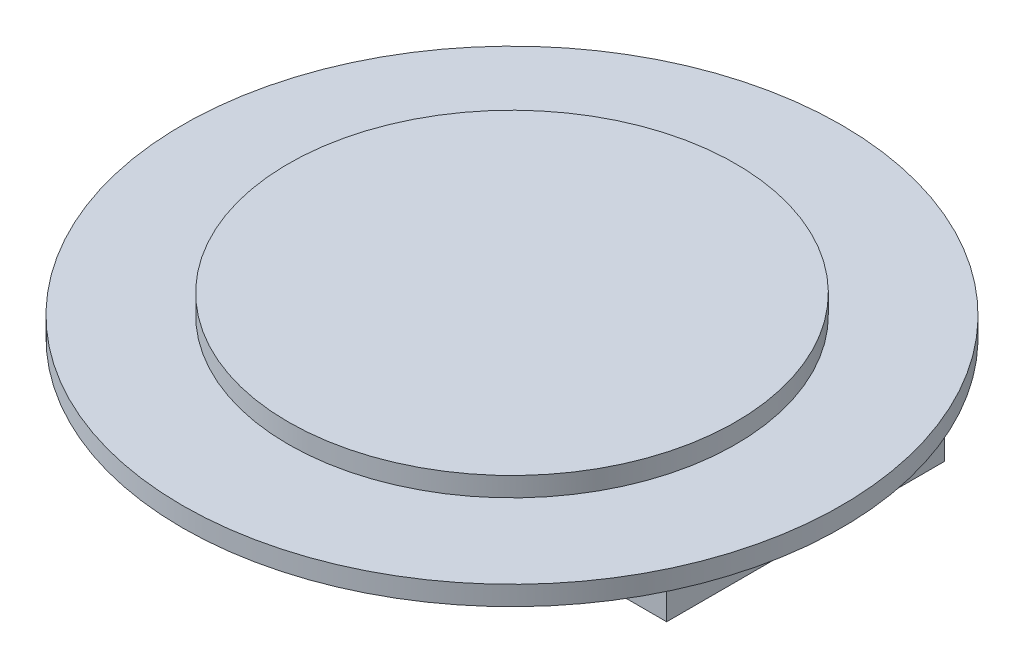
ISO-10303-21;
HEADER;
FILE_DESCRIPTION(('STEP AP214'),'2;1');
FILE_NAME('part.step','',(''),(''),'','','');
FILE_SCHEMA(('AUTOMOTIVE_DESIGN { 1 0 10303 214 1 1 1 1 }'));
ENDSEC;
DATA;
#1=APPLICATION_CONTEXT('core data for automotive mechanical design processes');
#2=APPLICATION_PROTOCOL_DEFINITION('international standard','automotive_design',2000,#1);
#3=PRODUCT_CONTEXT('',#1,'mechanical');
#4=PRODUCT('Part','Part','',(#3));
#5=PRODUCT_RELATED_PRODUCT_CATEGORY('part','',(#4));
#6=PRODUCT_DEFINITION_FORMATION('','',#4);
#7=PRODUCT_DEFINITION_CONTEXT('part definition',#1,'design');
#8=PRODUCT_DEFINITION('design','',#6,#7);
#9=PRODUCT_DEFINITION_SHAPE('','',#8);
#10=(LENGTH_UNIT() NAMED_UNIT(*) SI_UNIT(.MILLI.,.METRE.));
#11=(NAMED_UNIT(*) PLANE_ANGLE_UNIT() SI_UNIT($,.RADIAN.));
#12=(NAMED_UNIT(*) SI_UNIT($,.STERADIAN.) SOLID_ANGLE_UNIT());
#13=UNCERTAINTY_MEASURE_WITH_UNIT(LENGTH_MEASURE(1.E-05),#10,'distance_accuracy_value','');
#14=(GEOMETRIC_REPRESENTATION_CONTEXT(3) GLOBAL_UNCERTAINTY_ASSIGNED_CONTEXT((#13)) GLOBAL_UNIT_ASSIGNED_CONTEXT((#10,
#11,#12)) REPRESENTATION_CONTEXT('',''));
#15=CARTESIAN_POINT('',(0.,0.,0.));
#16=DIRECTION('',(0.,0.,1.));
#17=DIRECTION('',(1.,0.,0.));
#18=AXIS2_PLACEMENT_3D('',#15,#16,#17);
#19=CARTESIAN_POINT('',(0.,1.,0.));
#20=DIRECTION('',(0.,1.,0.));
#21=DIRECTION('',(0.,0.,1.));
#22=AXIS2_PLACEMENT_3D('',#19,#20,#21);
#23=PLANE('',#22);
#24=CARTESIAN_POINT('',(0.,1.,0.));
#25=DIRECTION('',(0.,1.,0.));
#26=DIRECTION('',(0.,0.,1.));
#27=AXIS2_PLACEMENT_3D('',#24,#25,#26);
#28=CIRCLE('',#27,17.);
#29=CARTESIAN_POINT('',(0.,1.,17.));
#30=VERTEX_POINT('',#29);
#31=EDGE_CURVE('E11',#30,#30,#28,.T.);
#32=ORIENTED_EDGE('',*,*,#31,.T.);
#33=EDGE_LOOP('',(#32));
#34=FACE_BOUND('',#33,.T.);
#35=CARTESIAN_POINT('',(0.,1.,0.));
#36=DIRECTION('',(0.,1.,0.));
#37=DIRECTION('',(0.,0.,1.));
#38=AXIS2_PLACEMENT_3D('',#35,#36,#37);
#39=CIRCLE('',#38,11.5392948538463);
#40=CARTESIAN_POINT('',(0.,1.,11.5392948538463));
#41=VERTEX_POINT('',#40);
#42=EDGE_CURVE('E112',#41,#41,#39,.T.);
#43=ORIENTED_EDGE('',*,*,#42,.F.);
#44=EDGE_LOOP('',(#43));
#45=FACE_BOUND('',#44,.T.);
#46=ADVANCED_FACE('F33',(#34,#45),#23,.T.);
#47=CARTESIAN_POINT('',(0.,0.,0.));
#48=DIRECTION('',(0.,1.,0.));
#49=DIRECTION('',(0.,0.,1.));
#50=AXIS2_PLACEMENT_3D('',#47,#48,#49);
#51=PLANE('',#50);
#52=CARTESIAN_POINT('',(0.,0.,0.));
#53=DIRECTION('',(0.,1.,0.));
#54=DIRECTION('',(0.,0.,1.));
#55=AXIS2_PLACEMENT_3D('',#52,#53,#54);
#56=CIRCLE('',#55,17.);
#57=CARTESIAN_POINT('',(0.,0.,17.));
#58=VERTEX_POINT('',#57);
#59=EDGE_CURVE('E37',#58,#58,#56,.T.);
#60=ORIENTED_EDGE('',*,*,#59,.F.);
#61=EDGE_LOOP('',(#60));
#62=FACE_BOUND('',#61,.T.);
#63=DIRECTION('',(0.,0.,1.));
#64=VECTOR('',#63,1.);
#65=CARTESIAN_POINT('',(12.6849787864955,0.,4.7063351619876));
#66=LINE('',#65,#64);
#67=CARTESIAN_POINT('',(12.6849787864955,0.,-9.63233219370707));
#68=VERTEX_POINT('',#67);
#69=CARTESIAN_POINT('',(12.6849787864955,0.,4.7063351619876));
#70=VERTEX_POINT('',#69);
#71=EDGE_CURVE('E94',#68,#70,#66,.T.);
#72=ORIENTED_EDGE('',*,*,#71,.F.);
#73=DIRECTION('',(1.,0.,0.));
#74=VECTOR('',#73,1.);
#75=CARTESIAN_POINT('',(-5.88066634954032,0.,-9.63233219370707));
#76=LINE('',#75,#74);
#77=CARTESIAN_POINT('',(-5.88066634954032,0.,-9.63233219370707));
#78=VERTEX_POINT('',#77);
#79=EDGE_CURVE('E91',#78,#68,#76,.T.);
#80=ORIENTED_EDGE('',*,*,#79,.F.);
#81=DIRECTION('',(0.,0.,-1.));
#82=VECTOR('',#81,1.);
#83=CARTESIAN_POINT('',(-5.88066634954032,0.,4.7063351619876));
#84=LINE('',#83,#82);
#85=CARTESIAN_POINT('',(-5.88066634954032,0.,4.7063351619876));
#86=VERTEX_POINT('',#85);
#87=EDGE_CURVE('E53',#86,#78,#84,.T.);
#88=ORIENTED_EDGE('',*,*,#87,.F.);
#89=DIRECTION('',(-1.,0.,0.));
#90=VECTOR('',#89,1.);
#91=CARTESIAN_POINT('',(-5.88066634954032,0.,4.7063351619876));
#92=LINE('',#91,#90);
#93=EDGE_CURVE('E48',#70,#86,#92,.T.);
#94=ORIENTED_EDGE('',*,*,#93,.F.);
#95=EDGE_LOOP('',(#72,#80,#88,#94));
#96=FACE_BOUND('',#95,.T.);
#97=ADVANCED_FACE('F127',(#62,#96),#51,.F.);
#98=CARTESIAN_POINT('',(0.,1.,0.));
#99=DIRECTION('',(0.,-1.,0.));
#100=DIRECTION('',(0.,0.,-1.));
#101=AXIS2_PLACEMENT_3D('',#98,#99,#100);
#102=CYLINDRICAL_SURFACE('',#101,17.);
#103=ORIENTED_EDGE('',*,*,#31,.F.);
#104=EDGE_LOOP('',(#103));
#105=FACE_BOUND('',#104,.T.);
#106=ORIENTED_EDGE('',*,*,#59,.T.);
#107=EDGE_LOOP('',(#106));
#108=FACE_BOUND('',#107,.T.);
#109=ADVANCED_FACE('F35',(#105,#108),#102,.T.);
#110=CARTESIAN_POINT('',(12.6849787864955,-4.,4.7063351619876));
#111=DIRECTION('',(-1.,0.,0.));
#112=DIRECTION('',(0.,0.,1.));
#113=AXIS2_PLACEMENT_3D('',#110,#111,#112);
#114=PLANE('',#113);
#115=ORIENTED_EDGE('',*,*,#71,.T.);
#116=DIRECTION('',(0.,1.,0.));
#117=VECTOR('',#116,1.);
#118=CARTESIAN_POINT('',(12.6849787864955,-4.,4.7063351619876));
#119=LINE('',#118,#117);
#120=CARTESIAN_POINT('',(12.6849787864955,-4.,4.7063351619876));
#121=VERTEX_POINT('',#120);
#122=EDGE_CURVE('E75',#121,#70,#119,.T.);
#123=ORIENTED_EDGE('',*,*,#122,.F.);
#124=DIRECTION('',(0.,0.,1.));
#125=VECTOR('',#124,1.);
#126=CARTESIAN_POINT('',(12.6849787864955,-4.,4.7063351619876));
#127=LINE('',#126,#125);
#128=CARTESIAN_POINT('',(12.6849787864955,-4.,-9.63233219370707));
#129=VERTEX_POINT('',#128);
#130=EDGE_CURVE('E82',#129,#121,#127,.T.);
#131=ORIENTED_EDGE('',*,*,#130,.F.);
#132=DIRECTION('',(0.,1.,0.));
#133=VECTOR('',#132,1.);
#134=CARTESIAN_POINT('',(12.6849787864955,-4.,-9.63233219370707));
#135=LINE('',#134,#133);
#136=EDGE_CURVE('E102',#129,#68,#135,.T.);
#137=ORIENTED_EDGE('',*,*,#136,.T.);
#138=EDGE_LOOP('',(#115,#123,#131,#137));
#139=FACE_BOUND('',#138,.T.);
#140=ADVANCED_FACE('F93',(#139),#114,.F.);
#141=CARTESIAN_POINT('',(-5.88066634954032,-4.,4.7063351619876));
#142=DIRECTION('',(0.,0.,-1.));
#143=DIRECTION('',(-1.,0.,0.));
#144=AXIS2_PLACEMENT_3D('',#141,#142,#143);
#145=PLANE('',#144);
#146=ORIENTED_EDGE('',*,*,#93,.T.);
#147=DIRECTION('',(0.,1.,0.));
#148=VECTOR('',#147,1.);
#149=CARTESIAN_POINT('',(-5.88066634954032,-4.,4.7063351619876));
#150=LINE('',#149,#148);
#151=CARTESIAN_POINT('',(-5.88066634954032,-4.,4.7063351619876));
#152=VERTEX_POINT('',#151);
#153=EDGE_CURVE('E78',#152,#86,#150,.T.);
#154=ORIENTED_EDGE('',*,*,#153,.F.);
#155=DIRECTION('',(-1.,0.,0.));
#156=VECTOR('',#155,1.);
#157=CARTESIAN_POINT('',(-5.88066634954032,-4.,4.7063351619876));
#158=LINE('',#157,#156);
#159=EDGE_CURVE('E71',#121,#152,#158,.T.);
#160=ORIENTED_EDGE('',*,*,#159,.F.);
#161=ORIENTED_EDGE('',*,*,#122,.T.);
#162=EDGE_LOOP('',(#146,#154,#160,#161));
#163=FACE_BOUND('',#162,.T.);
#164=ADVANCED_FACE('F73',(#163),#145,.F.);
#165=CARTESIAN_POINT('',(-5.88066634954032,-4.,4.7063351619876));
#166=DIRECTION('',(1.,0.,0.));
#167=DIRECTION('',(0.,0.,-1.));
#168=AXIS2_PLACEMENT_3D('',#165,#166,#167);
#169=PLANE('',#168);
#170=ORIENTED_EDGE('',*,*,#87,.T.);
#171=DIRECTION('',(0.,1.,0.));
#172=VECTOR('',#171,1.);
#173=CARTESIAN_POINT('',(-5.88066634954032,-4.,-9.63233219370707));
#174=LINE('',#173,#172);
#175=CARTESIAN_POINT('',(-5.88066634954032,-4.,-9.63233219370707));
#176=VERTEX_POINT('',#175);
#177=EDGE_CURVE('E97',#176,#78,#174,.T.);
#178=ORIENTED_EDGE('',*,*,#177,.F.);
#179=DIRECTION('',(0.,0.,-1.));
#180=VECTOR('',#179,1.);
#181=CARTESIAN_POINT('',(-5.88066634954032,-4.,4.7063351619876));
#182=LINE('',#181,#180);
#183=EDGE_CURVE('E81',#152,#176,#182,.T.);
#184=ORIENTED_EDGE('',*,*,#183,.F.);
#185=ORIENTED_EDGE('',*,*,#153,.T.);
#186=EDGE_LOOP('',(#170,#178,#184,#185));
#187=FACE_BOUND('',#186,.T.);
#188=ADVANCED_FACE('F139',(#187),#169,.F.);
#189=CARTESIAN_POINT('',(-5.88066634954032,-4.,-9.63233219370707));
#190=DIRECTION('',(0.,0.,1.));
#191=DIRECTION('',(1.,0.,0.));
#192=AXIS2_PLACEMENT_3D('',#189,#190,#191);
#193=PLANE('',#192);
#194=ORIENTED_EDGE('',*,*,#79,.T.);
#195=ORIENTED_EDGE('',*,*,#136,.F.);
#196=DIRECTION('',(1.,0.,0.));
#197=VECTOR('',#196,1.);
#198=CARTESIAN_POINT('',(-5.88066634954032,-4.,-9.63233219370707));
#199=LINE('',#198,#197);
#200=EDGE_CURVE('E87',#176,#129,#199,.T.);
#201=ORIENTED_EDGE('',*,*,#200,.F.);
#202=ORIENTED_EDGE('',*,*,#177,.T.);
#203=EDGE_LOOP('',(#194,#195,#201,#202));
#204=FACE_BOUND('',#203,.T.);
#205=ADVANCED_FACE('F142',(#204),#193,.F.);
#206=CARTESIAN_POINT('',(0.,-4.,0.));
#207=DIRECTION('',(0.,-1.,0.));
#208=DIRECTION('',(0.,0.,-1.));
#209=AXIS2_PLACEMENT_3D('',#206,#207,#208);
#210=PLANE('',#209);
#211=ORIENTED_EDGE('',*,*,#130,.T.);
#212=ORIENTED_EDGE('',*,*,#159,.T.);
#213=ORIENTED_EDGE('',*,*,#183,.T.);
#214=ORIENTED_EDGE('',*,*,#200,.T.);
#215=EDGE_LOOP('',(#211,#212,#213,#214));
#216=FACE_BOUND('',#215,.T.);
#217=ADVANCED_FACE('F85',(#216),#210,.T.);
#218=CARTESIAN_POINT('',(0.,2.,0.));
#219=DIRECTION('',(0.,-1.,0.));
#220=DIRECTION('',(0.,0.,-1.));
#221=AXIS2_PLACEMENT_3D('',#218,#219,#220);
#222=CYLINDRICAL_SURFACE('',#221,11.5392948538463);
#223=CARTESIAN_POINT('',(0.,2.,0.));
#224=DIRECTION('',(0.,1.,0.));
#225=DIRECTION('',(0.,0.,1.));
#226=AXIS2_PLACEMENT_3D('',#223,#224,#225);
#227=CIRCLE('',#226,11.5392948538463);
#228=CARTESIAN_POINT('',(0.,2.,11.5392948538463));
#229=VERTEX_POINT('',#228);
#230=EDGE_CURVE('E109',#229,#229,#227,.T.);
#231=ORIENTED_EDGE('',*,*,#230,.F.);
#232=EDGE_LOOP('',(#231));
#233=FACE_BOUND('',#232,.T.);
#234=ORIENTED_EDGE('',*,*,#42,.T.);
#235=EDGE_LOOP('',(#234));
#236=FACE_BOUND('',#235,.T.);
#237=ADVANCED_FACE('F120',(#233,#236),#222,.T.);
#238=CARTESIAN_POINT('',(0.,2.,0.));
#239=DIRECTION('',(0.,1.,0.));
#240=DIRECTION('',(0.,0.,1.));
#241=AXIS2_PLACEMENT_3D('',#238,#239,#240);
#242=PLANE('',#241);
#243=ORIENTED_EDGE('',*,*,#230,.T.);
#244=EDGE_LOOP('',(#243));
#245=FACE_BOUND('',#244,.T.);
#246=ADVANCED_FACE('F118',(#245),#242,.T.);
#247=CLOSED_SHELL('',(#46,#97,#109,#140,#164,#188,#205,#217,#237,#246));
#248=MANIFOLD_SOLID_BREP('B2',#247);
#249=ADVANCED_BREP_SHAPE_REPRESENTATION('',(#18,#248),#14);
#250=SHAPE_DEFINITION_REPRESENTATION(#9,#249);
ENDSEC;
END-ISO-10303-21;
